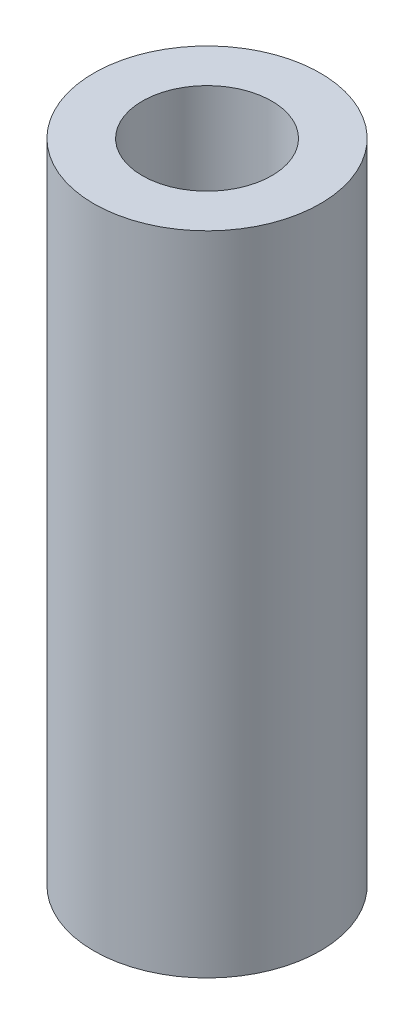
ISO-10303-21;
HEADER;
FILE_DESCRIPTION(('STEP AP214'),'2;1');
FILE_NAME('part.step','',(''),(''),'','','');
FILE_SCHEMA(('AUTOMOTIVE_DESIGN { 1 0 10303 214 1 1 1 1 }'));
ENDSEC;
DATA;
#1=APPLICATION_CONTEXT('core data for automotive mechanical design processes');
#2=APPLICATION_PROTOCOL_DEFINITION('international standard','automotive_design',2000,#1);
#3=PRODUCT_CONTEXT('',#1,'mechanical');
#4=PRODUCT('Part','Part','',(#3));
#5=PRODUCT_RELATED_PRODUCT_CATEGORY('part','',(#4));
#6=PRODUCT_DEFINITION_FORMATION('','',#4);
#7=PRODUCT_DEFINITION_CONTEXT('part definition',#1,'design');
#8=PRODUCT_DEFINITION('design','',#6,#7);
#9=PRODUCT_DEFINITION_SHAPE('','',#8);
#10=(LENGTH_UNIT() NAMED_UNIT(*) SI_UNIT(.MILLI.,.METRE.));
#11=(NAMED_UNIT(*) PLANE_ANGLE_UNIT() SI_UNIT($,.RADIAN.));
#12=(NAMED_UNIT(*) SI_UNIT($,.STERADIAN.) SOLID_ANGLE_UNIT());
#13=UNCERTAINTY_MEASURE_WITH_UNIT(LENGTH_MEASURE(1.E-05),#10,'distance_accuracy_value','');
#14=(GEOMETRIC_REPRESENTATION_CONTEXT(3) GLOBAL_UNCERTAINTY_ASSIGNED_CONTEXT((#13)) GLOBAL_UNIT_ASSIGNED_CONTEXT((#10,
#11,#12)) REPRESENTATION_CONTEXT('',''));
#15=CARTESIAN_POINT('',(0.,0.,0.));
#16=DIRECTION('',(0.,0.,1.));
#17=DIRECTION('',(1.,0.,0.));
#18=AXIS2_PLACEMENT_3D('',#15,#16,#17);
#19=CARTESIAN_POINT('',(0.,20.,0.));
#20=DIRECTION('',(0.,1.,0.));
#21=DIRECTION('',(0.,0.,1.));
#22=AXIS2_PLACEMENT_3D('',#19,#20,#21);
#23=PLANE('',#22);
#24=CARTESIAN_POINT('',(0.,20.,0.));
#25=DIRECTION('',(0.,1.,0.));
#26=DIRECTION('',(0.,0.,1.));
#27=AXIS2_PLACEMENT_3D('',#24,#25,#26);
#28=CIRCLE('',#27,3.5);
#29=CARTESIAN_POINT('',(0.,20.,3.5));
#30=VERTEX_POINT('',#29);
#31=EDGE_CURVE('E10',#30,#30,#28,.T.);
#32=ORIENTED_EDGE('',*,*,#31,.T.);
#33=EDGE_LOOP('',(#32));
#34=FACE_BOUND('',#33,.T.);
#35=CARTESIAN_POINT('',(0.,20.,0.));
#36=DIRECTION('',(0.,1.,0.));
#37=DIRECTION('',(0.,0.,1.));
#38=AXIS2_PLACEMENT_3D('',#35,#36,#37);
#39=CIRCLE('',#38,2.);
#40=CARTESIAN_POINT('',(0.,20.,2.));
#41=VERTEX_POINT('',#40);
#42=EDGE_CURVE('E43',#41,#41,#39,.T.);
#43=ORIENTED_EDGE('',*,*,#42,.F.);
#44=EDGE_LOOP('',(#43));
#45=FACE_BOUND('',#44,.T.);
#46=ADVANCED_FACE('F32',(#34,#45),#23,.T.);
#47=CARTESIAN_POINT('',(0.,0.,0.));
#48=DIRECTION('',(0.,1.,0.));
#49=DIRECTION('',(0.,0.,1.));
#50=AXIS2_PLACEMENT_3D('',#47,#48,#49);
#51=PLANE('',#50);
#52=CARTESIAN_POINT('',(0.,0.,0.));
#53=DIRECTION('',(0.,1.,0.));
#54=DIRECTION('',(0.,0.,1.));
#55=AXIS2_PLACEMENT_3D('',#52,#53,#54);
#56=CIRCLE('',#55,3.5);
#57=CARTESIAN_POINT('',(0.,0.,3.5));
#58=VERTEX_POINT('',#57);
#59=EDGE_CURVE('E36',#58,#58,#56,.T.);
#60=ORIENTED_EDGE('',*,*,#59,.F.);
#61=EDGE_LOOP('',(#60));
#62=FACE_BOUND('',#61,.T.);
#63=CARTESIAN_POINT('',(0.,0.,0.));
#64=DIRECTION('',(0.,1.,0.));
#65=DIRECTION('',(0.,0.,1.));
#66=AXIS2_PLACEMENT_3D('',#63,#64,#65);
#67=CIRCLE('',#66,2.);
#68=CARTESIAN_POINT('',(0.,0.,2.));
#69=VERTEX_POINT('',#68);
#70=EDGE_CURVE('E45',#69,#69,#67,.T.);
#71=ORIENTED_EDGE('',*,*,#70,.T.);
#72=EDGE_LOOP('',(#71));
#73=FACE_BOUND('',#72,.T.);
#74=ADVANCED_FACE('F55',(#62,#73),#51,.F.);
#75=CARTESIAN_POINT('',(0.,20.,0.));
#76=DIRECTION('',(0.,-1.,0.));
#77=DIRECTION('',(0.,0.,-1.));
#78=AXIS2_PLACEMENT_3D('',#75,#76,#77);
#79=CYLINDRICAL_SURFACE('',#78,3.5);
#80=ORIENTED_EDGE('',*,*,#31,.F.);
#81=EDGE_LOOP('',(#80));
#82=FACE_BOUND('',#81,.T.);
#83=ORIENTED_EDGE('',*,*,#59,.T.);
#84=EDGE_LOOP('',(#83));
#85=FACE_BOUND('',#84,.T.);
#86=ADVANCED_FACE('F34',(#82,#85),#79,.T.);
#87=CARTESIAN_POINT('',(0.,20.,0.));
#88=DIRECTION('',(0.,-1.,0.));
#89=DIRECTION('',(0.,0.,-1.));
#90=AXIS2_PLACEMENT_3D('',#87,#88,#89);
#91=CYLINDRICAL_SURFACE('',#90,2.);
#92=ORIENTED_EDGE('',*,*,#42,.T.);
#93=EDGE_LOOP('',(#92));
#94=FACE_BOUND('',#93,.T.);
#95=ORIENTED_EDGE('',*,*,#70,.F.);
#96=EDGE_LOOP('',(#95));
#97=FACE_BOUND('',#96,.T.);
#98=ADVANCED_FACE('F51',(#94,#97),#91,.F.);
#99=CLOSED_SHELL('',(#46,#74,#86,#98));
#100=MANIFOLD_SOLID_BREP('B2',#99);
#101=ADVANCED_BREP_SHAPE_REPRESENTATION('',(#18,#100),#14);
#102=SHAPE_DEFINITION_REPRESENTATION(#9,#101);
ENDSEC;
END-ISO-10303-21;
